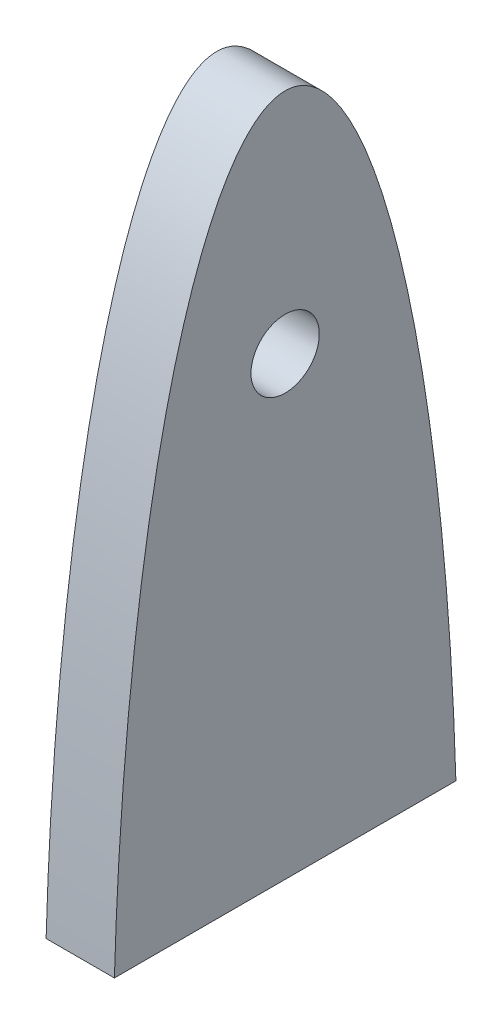
ISO-10303-21;
HEADER;
FILE_DESCRIPTION(('STEP AP214'),'2;1');
FILE_NAME('part.step','',(''),(''),'','','');
FILE_SCHEMA(('AUTOMOTIVE_DESIGN { 1 0 10303 214 1 1 1 1 }'));
ENDSEC;
DATA;
#1=APPLICATION_CONTEXT('core data for automotive mechanical design processes');
#2=APPLICATION_PROTOCOL_DEFINITION('international standard','automotive_design',2000,#1);
#3=PRODUCT_CONTEXT('',#1,'mechanical');
#4=PRODUCT('Part','Part','',(#3));
#5=PRODUCT_RELATED_PRODUCT_CATEGORY('part','',(#4));
#6=PRODUCT_DEFINITION_FORMATION('','',#4);
#7=PRODUCT_DEFINITION_CONTEXT('part definition',#1,'design');
#8=PRODUCT_DEFINITION('design','',#6,#7);
#9=PRODUCT_DEFINITION_SHAPE('','',#8);
#10=(LENGTH_UNIT() NAMED_UNIT(*) SI_UNIT(.MILLI.,.METRE.));
#11=(NAMED_UNIT(*) PLANE_ANGLE_UNIT() SI_UNIT($,.RADIAN.));
#12=(NAMED_UNIT(*) SI_UNIT($,.STERADIAN.) SOLID_ANGLE_UNIT());
#13=UNCERTAINTY_MEASURE_WITH_UNIT(LENGTH_MEASURE(1.E-05),#10,'distance_accuracy_value','');
#14=(GEOMETRIC_REPRESENTATION_CONTEXT(3) GLOBAL_UNCERTAINTY_ASSIGNED_CONTEXT((#13)) GLOBAL_UNIT_ASSIGNED_CONTEXT((#10,
#11,#12)) REPRESENTATION_CONTEXT('',''));
#15=CARTESIAN_POINT('',(0.,0.,0.));
#16=DIRECTION('',(0.,0.,1.));
#17=DIRECTION('',(1.,0.,0.));
#18=AXIS2_PLACEMENT_3D('',#15,#16,#17);
#19=CARTESIAN_POINT('',(0.,-4.73684210526317,0.));
#20=DIRECTION('',(1.,0.,0.));
#21=DIRECTION('',(0.,1.,0.));
#22=AXIS2_PLACEMENT_3D('',#19,#20,#21);
#23=ELLIPSE('',#22,34.7368421052631,7.57071921772854);
#24=DIRECTION('',(1.,0.,0.));
#25=VECTOR('',#24,1.);
#26=SURFACE_OF_LINEAR_EXTRUSION('',#23,#25);
#27=CARTESIAN_POINT('',(3.,-4.73684210526317,0.));
#28=DIRECTION('',(1.,0.,0.));
#29=DIRECTION('',(0.,1.,0.));
#30=AXIS2_PLACEMENT_3D('',#27,#28,#29);
#31=ELLIPSE('',#30,34.7368421052631,7.57071921772854);
#32=CARTESIAN_POINT('',(3.,0.,-7.5));
#33=VERTEX_POINT('',#32);
#34=CARTESIAN_POINT('',(3.,0.,7.5));
#35=VERTEX_POINT('',#34);
#36=EDGE_CURVE('E67',#33,#35,#31,.T.);
#37=ORIENTED_EDGE('',*,*,#36,.F.);
#38=DIRECTION('',(1.,0.,0.));
#39=VECTOR('',#38,1.);
#40=CARTESIAN_POINT('',(0.,0.,-7.5));
#41=LINE('',#40,#39);
#42=CARTESIAN_POINT('',(0.,0.,-7.5));
#43=VERTEX_POINT('',#42);
#44=EDGE_CURVE('E11',#43,#33,#41,.T.);
#45=ORIENTED_EDGE('',*,*,#44,.F.);
#46=CARTESIAN_POINT('',(0.,0.,7.5));
#47=VERTEX_POINT('',#46);
#48=EDGE_CURVE('E72',#43,#47,#23,.T.);
#49=ORIENTED_EDGE('',*,*,#48,.T.);
#50=DIRECTION('',(1.,0.,0.));
#51=VECTOR('',#50,1.);
#52=CARTESIAN_POINT('',(0.,0.,7.5));
#53=LINE('',#52,#51);
#54=EDGE_CURVE('E41',#47,#35,#53,.T.);
#55=ORIENTED_EDGE('',*,*,#54,.T.);
#56=EDGE_LOOP('',(#37,#45,#49,#55));
#57=FACE_BOUND('',#56,.T.);
#58=ADVANCED_FACE('F37',(#57),#26,.T.);
#59=CARTESIAN_POINT('',(0.,0.,7.5));
#60=DIRECTION('',(0.,-1.,0.));
#61=DIRECTION('',(0.,0.,-1.));
#62=AXIS2_PLACEMENT_3D('',#59,#60,#61);
#63=PLANE('',#62);
#64=DIRECTION('',(0.,0.,-1.));
#65=VECTOR('',#64,1.);
#66=CARTESIAN_POINT('',(3.,0.,7.5));
#67=LINE('',#66,#65);
#68=EDGE_CURVE('E64',#35,#33,#67,.T.);
#69=ORIENTED_EDGE('',*,*,#68,.F.);
#70=ORIENTED_EDGE('',*,*,#54,.F.);
#71=DIRECTION('',(0.,0.,-1.));
#72=VECTOR('',#71,1.);
#73=CARTESIAN_POINT('',(0.,0.,7.5));
#74=LINE('',#73,#72);
#75=EDGE_CURVE('E66',#47,#43,#74,.T.);
#76=ORIENTED_EDGE('',*,*,#75,.T.);
#77=ORIENTED_EDGE('',*,*,#44,.T.);
#78=EDGE_LOOP('',(#69,#70,#76,#77));
#79=FACE_BOUND('',#78,.T.);
#80=ADVANCED_FACE('F62',(#79),#63,.T.);
#81=CARTESIAN_POINT('',(0.,-4.73684210526317,0.));
#82=DIRECTION('',(1.,0.,0.));
#83=DIRECTION('',(0.,0.,-1.));
#84=AXIS2_PLACEMENT_3D('',#81,#82,#83);
#85=PLANE('',#84);
#86=CARTESIAN_POINT('',(0.,20.,0.));
#87=DIRECTION('',(1.,0.,0.));
#88=DIRECTION('',(0.,0.,1.));
#89=AXIS2_PLACEMENT_3D('',#86,#87,#88);
#90=CIRCLE('',#89,1.5);
#91=CARTESIAN_POINT('',(0.,20.,1.5));
#92=VERTEX_POINT('',#91);
#93=EDGE_CURVE('E69',#92,#92,#90,.T.);
#94=ORIENTED_EDGE('',*,*,#93,.T.);
#95=EDGE_LOOP('',(#94));
#96=FACE_BOUND('',#95,.T.);
#97=ORIENTED_EDGE('',*,*,#48,.F.);
#98=ORIENTED_EDGE('',*,*,#75,.F.);
#99=EDGE_LOOP('',(#97,#98));
#100=FACE_BOUND('',#99,.T.);
#101=ADVANCED_FACE('F83',(#96,#100),#85,.F.);
#102=CARTESIAN_POINT('',(3.,-4.73684210526317,0.));
#103=DIRECTION('',(1.,0.,0.));
#104=DIRECTION('',(0.,0.,-1.));
#105=AXIS2_PLACEMENT_3D('',#102,#103,#104);
#106=PLANE('',#105);
#107=CARTESIAN_POINT('',(3.,20.,0.));
#108=DIRECTION('',(1.,0.,0.));
#109=DIRECTION('',(0.,0.,1.));
#110=AXIS2_PLACEMENT_3D('',#107,#108,#109);
#111=CIRCLE('',#110,1.5);
#112=CARTESIAN_POINT('',(3.,20.,1.5));
#113=VERTEX_POINT('',#112);
#114=EDGE_CURVE('E77',#113,#113,#111,.T.);
#115=ORIENTED_EDGE('',*,*,#114,.F.);
#116=EDGE_LOOP('',(#115));
#117=FACE_BOUND('',#116,.T.);
#118=ORIENTED_EDGE('',*,*,#36,.T.);
#119=ORIENTED_EDGE('',*,*,#68,.T.);
#120=EDGE_LOOP('',(#118,#119));
#121=FACE_BOUND('',#120,.T.);
#122=ADVANCED_FACE('F71',(#117,#121),#106,.T.);
#123=CARTESIAN_POINT('',(0.,20.,0.));
#124=DIRECTION('',(1.,0.,0.));
#125=DIRECTION('',(0.,0.,-1.));
#126=AXIS2_PLACEMENT_3D('',#123,#124,#125);
#127=CYLINDRICAL_SURFACE('',#126,1.5);
#128=ORIENTED_EDGE('',*,*,#93,.F.);
#129=EDGE_LOOP('',(#128));
#130=FACE_BOUND('',#129,.T.);
#131=ORIENTED_EDGE('',*,*,#114,.T.);
#132=EDGE_LOOP('',(#131));
#133=FACE_BOUND('',#132,.T.);
#134=ADVANCED_FACE('F86',(#130,#133),#127,.F.);
#135=CLOSED_SHELL('',(#58,#80,#101,#122,#134));
#136=MANIFOLD_SOLID_BREP('B2',#135);
#137=ADVANCED_BREP_SHAPE_REPRESENTATION('',(#18,#136),#14);
#138=SHAPE_DEFINITION_REPRESENTATION(#9,#137);
ENDSEC;
END-ISO-10303-21;
